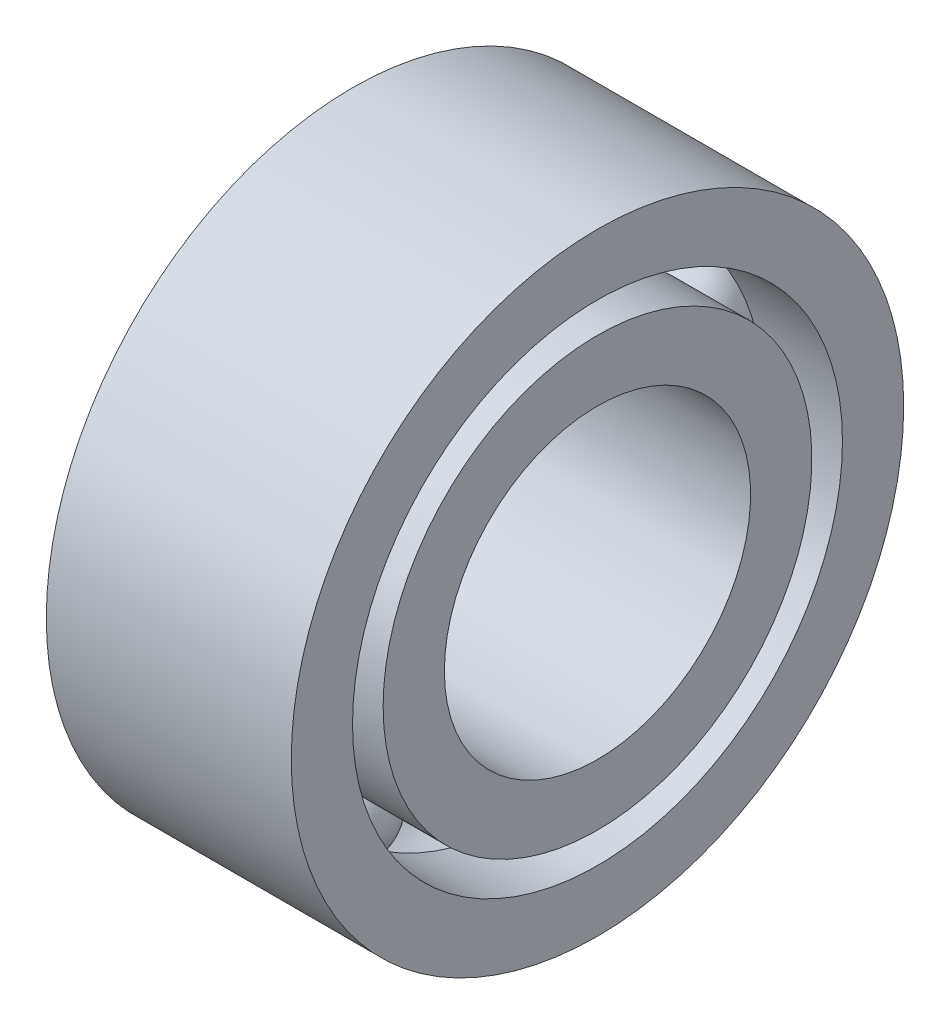
ISO-10303-21;
HEADER;
FILE_DESCRIPTION(('STEP AP214'),'2;1');
FILE_NAME('part.step','',(''),(''),'','','');
FILE_SCHEMA(('AUTOMOTIVE_DESIGN { 1 0 10303 214 1 1 1 1 }'));
ENDSEC;
DATA;
#1=APPLICATION_CONTEXT('core data for automotive mechanical design processes');
#2=APPLICATION_PROTOCOL_DEFINITION('international standard','automotive_design',2000,#1);
#3=PRODUCT_CONTEXT('',#1,'mechanical');
#4=PRODUCT('Part','Part','',(#3));
#5=PRODUCT_RELATED_PRODUCT_CATEGORY('part','',(#4));
#6=PRODUCT_DEFINITION_FORMATION('','',#4);
#7=PRODUCT_DEFINITION_CONTEXT('part definition',#1,'design');
#8=PRODUCT_DEFINITION('design','',#6,#7);
#9=PRODUCT_DEFINITION_SHAPE('','',#8);
#10=(LENGTH_UNIT() NAMED_UNIT(*) SI_UNIT(.MILLI.,.METRE.));
#11=(NAMED_UNIT(*) PLANE_ANGLE_UNIT() SI_UNIT($,.RADIAN.));
#12=(NAMED_UNIT(*) SI_UNIT($,.STERADIAN.) SOLID_ANGLE_UNIT());
#13=UNCERTAINTY_MEASURE_WITH_UNIT(LENGTH_MEASURE(1.E-05),#10,'distance_accuracy_value','');
#14=(GEOMETRIC_REPRESENTATION_CONTEXT(3) GLOBAL_UNCERTAINTY_ASSIGNED_CONTEXT((#13)) GLOBAL_UNIT_ASSIGNED_CONTEXT((#10,
#11,#12)) REPRESENTATION_CONTEXT('',''));
#15=CARTESIAN_POINT('',(0.,0.,0.));
#16=DIRECTION('',(0.,0.,1.));
#17=DIRECTION('',(1.,0.,0.));
#18=AXIS2_PLACEMENT_3D('',#15,#16,#17);
#19=CARTESIAN_POINT('',(0.,3.03381372890608,2.20419469609673));
#20=DIRECTION('',(-1.,0.,0.));
#21=DIRECTION('',(0.,0.809016994374955,0.587785252292462));
#22=AXIS2_PLACEMENT_3D('',#19,#20,#21);
#23=SPHERICAL_SURFACE('',#22,0.75);
#24=CARTESIAN_POINT('',(-0.75,3.03381372890608,2.20419469609673));
#25=VERTEX_POINT('',#24);
#26=VERTEX_LOOP('',#25);
#27=FACE_BOUND('',#26,.T.);
#28=ADVANCED_FACE('F46',(#27),#23,.T.);
#29=CLOSED_SHELL('',(#28));
#30=MANIFOLD_SOLID_BREP('B2',#29);
#31=CARTESIAN_POINT('',(0.,1.15881372890609,3.56646193610681));
#32=DIRECTION('',(-1.,0.,0.));
#33=DIRECTION('',(0.,0.309016994374958,0.95105651629515));
#34=AXIS2_PLACEMENT_3D('',#31,#32,#33);
#35=SPHERICAL_SURFACE('',#34,0.75);
#36=CARTESIAN_POINT('',(-0.75,1.15881372890609,3.56646193610681));
#37=VERTEX_POINT('',#36);
#38=VERTEX_LOOP('',#37);
#39=FACE_BOUND('',#38,.T.);
#40=ADVANCED_FACE('F67',(#39),#35,.T.);
#41=CLOSED_SHELL('',(#40));
#42=MANIFOLD_SOLID_BREP('B6',#41);
#43=CARTESIAN_POINT('',(0.,-1.15881372890602,3.56646193610684));
#44=DIRECTION('',(-1.,0.,0.));
#45=DIRECTION('',(0.,-0.309016994374938,0.951056516295157));
#46=AXIS2_PLACEMENT_3D('',#43,#44,#45);
#47=SPHERICAL_SURFACE('',#46,0.75);
#48=CARTESIAN_POINT('',(-0.75,-1.15881372890602,3.56646193610684));
#49=VERTEX_POINT('',#48);
#50=VERTEX_LOOP('',#49);
#51=FACE_BOUND('',#50,.T.);
#52=ADVANCED_FACE('F85',(#51),#47,.T.);
#53=CLOSED_SHELL('',(#52));
#54=MANIFOLD_SOLID_BREP('B42',#53);
#55=CARTESIAN_POINT('',(0.,-3.03381372890603,2.2041946960968));
#56=DIRECTION('',(-1.,0.,0.));
#57=DIRECTION('',(0.,-0.809016994374942,0.58778525229248));
#58=AXIS2_PLACEMENT_3D('',#55,#56,#57);
#59=SPHERICAL_SURFACE('',#58,0.75);
#60=CARTESIAN_POINT('',(-0.75,-3.03381372890603,2.2041946960968));
#61=VERTEX_POINT('',#60);
#62=VERTEX_LOOP('',#61);
#63=FACE_BOUND('',#62,.T.);
#64=ADVANCED_FACE('F104',(#63),#59,.T.);
#65=CLOSED_SHELL('',(#64));
#66=MANIFOLD_SOLID_BREP('B63',#65);
#67=CARTESIAN_POINT('',(0.,-3.75,0.));
#68=DIRECTION('',(-1.,0.,0.));
#69=DIRECTION('',(0.,-1.,0.));
#70=AXIS2_PLACEMENT_3D('',#67,#68,#69);
#71=SPHERICAL_SURFACE('',#70,0.75);
#72=CARTESIAN_POINT('',(-0.75,-3.75,0.));
#73=VERTEX_POINT('',#72);
#74=VERTEX_LOOP('',#73);
#75=FACE_BOUND('',#74,.T.);
#76=ADVANCED_FACE('F125',(#75),#71,.T.);
#77=CLOSED_SHELL('',(#76));
#78=MANIFOLD_SOLID_BREP('B81',#77);
#79=CARTESIAN_POINT('',(0.,-3.03381372890607,-2.20419469609676));
#80=DIRECTION('',(-1.,0.,0.));
#81=DIRECTION('',(0.,-0.809016994374951,-0.587785252292469));
#82=AXIS2_PLACEMENT_3D('',#79,#80,#81);
#83=SPHERICAL_SURFACE('',#82,0.75);
#84=CARTESIAN_POINT('',(-0.75,-3.03381372890607,-2.20419469609676));
#85=VERTEX_POINT('',#84);
#86=VERTEX_LOOP('',#85);
#87=FACE_BOUND('',#86,.T.);
#88=ADVANCED_FACE('F143',(#87),#83,.T.);
#89=CLOSED_SHELL('',(#88));
#90=MANIFOLD_SOLID_BREP('B100',#89);
#91=CARTESIAN_POINT('',(0.,-1.15881372890607,-3.56646193610682));
#92=DIRECTION('',(-1.,0.,0.));
#93=DIRECTION('',(0.,-0.309016994374952,-0.951056516295152));
#94=AXIS2_PLACEMENT_3D('',#91,#92,#93);
#95=SPHERICAL_SURFACE('',#94,0.75);
#96=CARTESIAN_POINT('',(-0.75,-1.15881372890607,-3.56646193610682));
#97=VERTEX_POINT('',#96);
#98=VERTEX_LOOP('',#97);
#99=FACE_BOUND('',#98,.T.);
#100=ADVANCED_FACE('F162',(#99),#95,.T.);
#101=CLOSED_SHELL('',(#100));
#102=MANIFOLD_SOLID_BREP('B121',#101);
#103=CARTESIAN_POINT('',(0.,1.15881372890604,-3.56646193610683));
#104=DIRECTION('',(-1.,0.,0.));
#105=DIRECTION('',(0.,0.309016994374945,-0.951056516295155));
#106=AXIS2_PLACEMENT_3D('',#103,#104,#105);
#107=SPHERICAL_SURFACE('',#106,0.75);
#108=CARTESIAN_POINT('',(-0.75,1.15881372890604,-3.56646193610683));
#109=VERTEX_POINT('',#108);
#110=VERTEX_LOOP('',#109);
#111=FACE_BOUND('',#110,.T.);
#112=ADVANCED_FACE('F183',(#111),#107,.T.);
#113=CLOSED_SHELL('',(#112));
#114=MANIFOLD_SOLID_BREP('B139',#113);
#115=CARTESIAN_POINT('',(0.,3.03381372890605,-2.20419469609678));
#116=DIRECTION('',(-1.,0.,0.));
#117=DIRECTION('',(0.,0.809016994374947,-0.587785252292474));
#118=AXIS2_PLACEMENT_3D('',#115,#116,#117);
#119=SPHERICAL_SURFACE('',#118,0.75);
#120=CARTESIAN_POINT('',(-0.75,3.03381372890605,-2.20419469609678));
#121=VERTEX_POINT('',#120);
#122=VERTEX_LOOP('',#121);
#123=FACE_BOUND('',#122,.T.);
#124=ADVANCED_FACE('F201',(#123),#119,.T.);
#125=CLOSED_SHELL('',(#124));
#126=MANIFOLD_SOLID_BREP('B158',#125);
#127=CARTESIAN_POINT('',(0.,3.75,0.));
#128=DIRECTION('',(-1.,0.,0.));
#129=DIRECTION('',(0.,1.,0.));
#130=AXIS2_PLACEMENT_3D('',#127,#128,#129);
#131=SPHERICAL_SURFACE('',#130,0.75);
#132=CARTESIAN_POINT('',(-0.75,3.75,0.));
#133=VERTEX_POINT('',#132);
#134=VERTEX_LOOP('',#133);
#135=FACE_BOUND('',#134,.T.);
#136=ADVANCED_FACE('F223',(#135),#131,.T.);
#137=CLOSED_SHELL('',(#136));
#138=MANIFOLD_SOLID_BREP('B179',#137);
#139=CARTESIAN_POINT('',(2.,3.5,0.));
#140=DIRECTION('',(-1.,0.,0.));
#141=DIRECTION('',(0.,0.,1.));
#142=AXIS2_PLACEMENT_3D('',#139,#140,#141);
#143=PLANE('',#142);
#144=CARTESIAN_POINT('',(2.,0.,0.));
#145=DIRECTION('',(-1.,0.,0.));
#146=DIRECTION('',(0.,0.,1.));
#147=AXIS2_PLACEMENT_3D('',#144,#145,#146);
#148=CIRCLE('',#147,3.5);
#149=CARTESIAN_POINT('',(2.,0.,3.5));
#150=VERTEX_POINT('',#149);
#151=EDGE_CURVE('E222',#150,#150,#148,.T.);
#152=ORIENTED_EDGE('',*,*,#151,.F.);
#153=EDGE_LOOP('',(#152));
#154=FACE_BOUND('',#153,.T.);
#155=CARTESIAN_POINT('',(2.,0.,0.));
#156=DIRECTION('',(-1.,0.,0.));
#157=DIRECTION('',(0.,0.,1.));
#158=AXIS2_PLACEMENT_3D('',#155,#156,#157);
#159=CIRCLE('',#158,2.5);
#160=CARTESIAN_POINT('',(2.,0.,2.5));
#161=VERTEX_POINT('',#160);
#162=EDGE_CURVE('E272',#161,#161,#159,.T.);
#163=ORIENTED_EDGE('',*,*,#162,.T.);
#164=EDGE_LOOP('',(#163));
#165=FACE_BOUND('',#164,.T.);
#166=ADVANCED_FACE('F250',(#154,#165),#143,.F.);
#167=CARTESIAN_POINT('',(-3.65320684264869,0.,0.));
#168=DIRECTION('',(-1.,0.,0.));
#169=DIRECTION('',(0.,0.,1.));
#170=AXIS2_PLACEMENT_3D('',#167,#168,#169);
#171=CYLINDRICAL_SURFACE('',#170,3.5);
#172=CARTESIAN_POINT('',(0.707106781186548,0.,0.));
#173=DIRECTION('',(-1.,0.,0.));
#174=DIRECTION('',(0.,0.,1.));
#175=AXIS2_PLACEMENT_3D('',#172,#173,#174);
#176=CIRCLE('',#175,3.5);
#177=CARTESIAN_POINT('',(0.707106781186548,0.,3.5));
#178=VERTEX_POINT('',#177);
#179=EDGE_CURVE('E256',#178,#178,#176,.T.);
#180=ORIENTED_EDGE('',*,*,#179,.F.);
#181=EDGE_LOOP('',(#180));
#182=FACE_BOUND('',#181,.T.);
#183=ORIENTED_EDGE('',*,*,#151,.T.);
#184=EDGE_LOOP('',(#183));
#185=FACE_BOUND('',#184,.T.);
#186=ADVANCED_FACE('F297',(#182,#185),#171,.T.);
#187=CARTESIAN_POINT('',(0.,0.,0.));
#188=DIRECTION('',(-1.,0.,0.));
#189=DIRECTION('',(0.,0.,1.));
#190=AXIS2_PLACEMENT_3D('',#187,#188,#189);
#191=TOROIDAL_SURFACE('',#190,3.75,0.75);
#192=ORIENTED_EDGE('',*,*,#179,.T.);
#193=EDGE_LOOP('',(#192));
#194=FACE_BOUND('',#193,.T.);
#195=CARTESIAN_POINT('',(-0.707106781186548,0.,0.));
#196=DIRECTION('',(-1.,0.,0.));
#197=DIRECTION('',(0.,0.,1.));
#198=AXIS2_PLACEMENT_3D('',#195,#196,#197);
#199=CIRCLE('',#198,3.5);
#200=CARTESIAN_POINT('',(-0.707106781186548,0.,3.5));
#201=VERTEX_POINT('',#200);
#202=EDGE_CURVE('E260',#201,#201,#199,.T.);
#203=ORIENTED_EDGE('',*,*,#202,.F.);
#204=EDGE_LOOP('',(#203));
#205=FACE_BOUND('',#204,.T.);
#206=ADVANCED_FACE('F292',(#194,#205),#191,.F.);
#207=CARTESIAN_POINT('',(-3.65320684264869,0.,0.));
#208=DIRECTION('',(-1.,0.,0.));
#209=DIRECTION('',(0.,0.,1.));
#210=AXIS2_PLACEMENT_3D('',#207,#208,#209);
#211=CYLINDRICAL_SURFACE('',#210,3.5);
#212=CARTESIAN_POINT('',(-2.,0.,0.));
#213=DIRECTION('',(-1.,0.,0.));
#214=DIRECTION('',(0.,0.,1.));
#215=AXIS2_PLACEMENT_3D('',#212,#213,#214);
#216=CIRCLE('',#215,3.5);
#217=CARTESIAN_POINT('',(-2.,0.,3.5));
#218=VERTEX_POINT('',#217);
#219=EDGE_CURVE('E264',#218,#218,#216,.T.);
#220=ORIENTED_EDGE('',*,*,#219,.F.);
#221=EDGE_LOOP('',(#220));
#222=FACE_BOUND('',#221,.T.);
#223=ORIENTED_EDGE('',*,*,#202,.T.);
#224=EDGE_LOOP('',(#223));
#225=FACE_BOUND('',#224,.T.);
#226=ADVANCED_FACE('F286',(#222,#225),#211,.T.);
#227=CARTESIAN_POINT('',(-2.,2.5,0.));
#228=DIRECTION('',(1.,0.,0.));
#229=DIRECTION('',(0.,0.,-1.));
#230=AXIS2_PLACEMENT_3D('',#227,#228,#229);
#231=PLANE('',#230);
#232=CARTESIAN_POINT('',(-2.,0.,0.));
#233=DIRECTION('',(-1.,0.,0.));
#234=DIRECTION('',(0.,0.,1.));
#235=AXIS2_PLACEMENT_3D('',#232,#233,#234);
#236=CIRCLE('',#235,2.5);
#237=CARTESIAN_POINT('',(-2.,0.,2.5));
#238=VERTEX_POINT('',#237);
#239=EDGE_CURVE('E269',#238,#238,#236,.T.);
#240=ORIENTED_EDGE('',*,*,#239,.F.);
#241=EDGE_LOOP('',(#240));
#242=FACE_BOUND('',#241,.T.);
#243=ORIENTED_EDGE('',*,*,#219,.T.);
#244=EDGE_LOOP('',(#243));
#245=FACE_BOUND('',#244,.T.);
#246=ADVANCED_FACE('F280',(#242,#245),#231,.F.);
#247=CARTESIAN_POINT('',(-3.65320684264869,0.,0.));
#248=DIRECTION('',(-1.,0.,0.));
#249=DIRECTION('',(0.,0.,1.));
#250=AXIS2_PLACEMENT_3D('',#247,#248,#249);
#251=CYLINDRICAL_SURFACE('',#250,2.5);
#252=ORIENTED_EDGE('',*,*,#162,.F.);
#253=EDGE_LOOP('',(#252));
#254=FACE_BOUND('',#253,.T.);
#255=ORIENTED_EDGE('',*,*,#239,.T.);
#256=EDGE_LOOP('',(#255));
#257=FACE_BOUND('',#256,.T.);
#258=ADVANCED_FACE('F277',(#254,#257),#251,.F.);
#259=CLOSED_SHELL('',(#166,#186,#206,#226,#246,#258));
#260=MANIFOLD_SOLID_BREP('B197',#259);
#261=CARTESIAN_POINT('',(-2.,4.,0.));
#262=DIRECTION('',(1.,0.,0.));
#263=DIRECTION('',(0.,0.,-1.));
#264=AXIS2_PLACEMENT_3D('',#261,#262,#263);
#265=PLANE('',#264);
#266=CARTESIAN_POINT('',(-2.,0.,0.));
#267=DIRECTION('',(-1.,0.,0.));
#268=DIRECTION('',(0.,0.,1.));
#269=AXIS2_PLACEMENT_3D('',#266,#267,#268);
#270=CIRCLE('',#269,4.);
#271=CARTESIAN_POINT('',(-2.,0.,4.));
#272=VERTEX_POINT('',#271);
#273=EDGE_CURVE('E353',#272,#272,#270,.T.);
#274=ORIENTED_EDGE('',*,*,#273,.F.);
#275=EDGE_LOOP('',(#274));
#276=FACE_BOUND('',#275,.T.);
#277=CARTESIAN_POINT('',(-2.,0.,0.));
#278=DIRECTION('',(-1.,0.,0.));
#279=DIRECTION('',(0.,0.,1.));
#280=AXIS2_PLACEMENT_3D('',#277,#278,#279);
#281=CIRCLE('',#280,5.);
#282=CARTESIAN_POINT('',(-2.,0.,5.));
#283=VERTEX_POINT('',#282);
#284=EDGE_CURVE('E249',#283,#283,#281,.T.);
#285=ORIENTED_EDGE('',*,*,#284,.T.);
#286=EDGE_LOOP('',(#285));
#287=FACE_BOUND('',#286,.T.);
#288=ADVANCED_FACE('F347',(#276,#287),#265,.F.);
#289=CARTESIAN_POINT('',(-3.65320684264869,0.,0.));
#290=DIRECTION('',(-1.,0.,0.));
#291=DIRECTION('',(0.,0.,1.));
#292=AXIS2_PLACEMENT_3D('',#289,#290,#291);
#293=CYLINDRICAL_SURFACE('',#292,4.);
#294=CARTESIAN_POINT('',(-0.707106781186548,0.,0.));
#295=DIRECTION('',(-1.,0.,0.));
#296=DIRECTION('',(0.,0.,1.));
#297=AXIS2_PLACEMENT_3D('',#294,#295,#296);
#298=CIRCLE('',#297,4.);
#299=CARTESIAN_POINT('',(-0.707106781186548,0.,4.));
#300=VERTEX_POINT('',#299);
#301=EDGE_CURVE('E357',#300,#300,#298,.T.);
#302=ORIENTED_EDGE('',*,*,#301,.F.);
#303=EDGE_LOOP('',(#302));
#304=FACE_BOUND('',#303,.T.);
#305=ORIENTED_EDGE('',*,*,#273,.T.);
#306=EDGE_LOOP('',(#305));
#307=FACE_BOUND('',#306,.T.);
#308=ADVANCED_FACE('F389',(#304,#307),#293,.F.);
#309=CARTESIAN_POINT('',(0.,0.,0.));
#310=DIRECTION('',(-1.,0.,0.));
#311=DIRECTION('',(0.,0.,1.));
#312=AXIS2_PLACEMENT_3D('',#309,#310,#311);
#313=TOROIDAL_SURFACE('',#312,3.75,0.75);
#314=ORIENTED_EDGE('',*,*,#301,.T.);
#315=EDGE_LOOP('',(#314));
#316=FACE_BOUND('',#315,.T.);
#317=CARTESIAN_POINT('',(0.707106781186548,0.,0.));
#318=DIRECTION('',(-1.,0.,0.));
#319=DIRECTION('',(0.,0.,1.));
#320=AXIS2_PLACEMENT_3D('',#317,#318,#319);
#321=CIRCLE('',#320,4.);
#322=CARTESIAN_POINT('',(0.707106781186548,0.,4.));
#323=VERTEX_POINT('',#322);
#324=EDGE_CURVE('E361',#323,#323,#321,.T.);
#325=ORIENTED_EDGE('',*,*,#324,.F.);
#326=EDGE_LOOP('',(#325));
#327=FACE_BOUND('',#326,.T.);
#328=ADVANCED_FACE('F384',(#316,#327),#313,.F.);
#329=CARTESIAN_POINT('',(-3.65320684264869,0.,0.));
#330=DIRECTION('',(-1.,0.,0.));
#331=DIRECTION('',(0.,0.,1.));
#332=AXIS2_PLACEMENT_3D('',#329,#330,#331);
#333=CYLINDRICAL_SURFACE('',#332,4.);
#334=CARTESIAN_POINT('',(2.,0.,0.));
#335=DIRECTION('',(-1.,0.,0.));
#336=DIRECTION('',(0.,0.,1.));
#337=AXIS2_PLACEMENT_3D('',#334,#335,#336);
#338=CIRCLE('',#337,4.);
#339=CARTESIAN_POINT('',(2.,0.,4.));
#340=VERTEX_POINT('',#339);
#341=EDGE_CURVE('E366',#340,#340,#338,.T.);
#342=ORIENTED_EDGE('',*,*,#341,.F.);
#343=EDGE_LOOP('',(#342));
#344=FACE_BOUND('',#343,.T.);
#345=ORIENTED_EDGE('',*,*,#324,.T.);
#346=EDGE_LOOP('',(#345));
#347=FACE_BOUND('',#346,.T.);
#348=ADVANCED_FACE('F378',(#344,#347),#333,.F.);
#349=CARTESIAN_POINT('',(2.,5.,0.));
#350=DIRECTION('',(-1.,0.,0.));
#351=DIRECTION('',(0.,0.,1.));
#352=AXIS2_PLACEMENT_3D('',#349,#350,#351);
#353=PLANE('',#352);
#354=CARTESIAN_POINT('',(2.,0.,0.));
#355=DIRECTION('',(-1.,0.,0.));
#356=DIRECTION('',(0.,0.,1.));
#357=AXIS2_PLACEMENT_3D('',#354,#355,#356);
#358=CIRCLE('',#357,5.);
#359=CARTESIAN_POINT('',(2.,0.,5.));
#360=VERTEX_POINT('',#359);
#361=EDGE_CURVE('E369',#360,#360,#358,.T.);
#362=ORIENTED_EDGE('',*,*,#361,.F.);
#363=EDGE_LOOP('',(#362));
#364=FACE_BOUND('',#363,.T.);
#365=ORIENTED_EDGE('',*,*,#341,.T.);
#366=EDGE_LOOP('',(#365));
#367=FACE_BOUND('',#366,.T.);
#368=ADVANCED_FACE('F375',(#364,#367),#353,.F.);
#369=CARTESIAN_POINT('',(-3.65320684264869,0.,0.));
#370=DIRECTION('',(-1.,0.,0.));
#371=DIRECTION('',(0.,0.,1.));
#372=AXIS2_PLACEMENT_3D('',#369,#370,#371);
#373=CYLINDRICAL_SURFACE('',#372,5.);
#374=ORIENTED_EDGE('',*,*,#284,.F.);
#375=EDGE_LOOP('',(#374));
#376=FACE_BOUND('',#375,.T.);
#377=ORIENTED_EDGE('',*,*,#361,.T.);
#378=EDGE_LOOP('',(#377));
#379=FACE_BOUND('',#378,.T.);
#380=ADVANCED_FACE('F373',(#376,#379),#373,.T.);
#381=CLOSED_SHELL('',(#288,#308,#328,#348,#368,#380));
#382=MANIFOLD_SOLID_BREP('B217',#381);
#383=ADVANCED_BREP_SHAPE_REPRESENTATION('',(#18,#30,#42,#54,#66,#78,#90,#102,#114,#126,#138,
#260,#382),#14);
#384=SHAPE_DEFINITION_REPRESENTATION(#9,#383);
ENDSEC;
END-ISO-10303-21;
